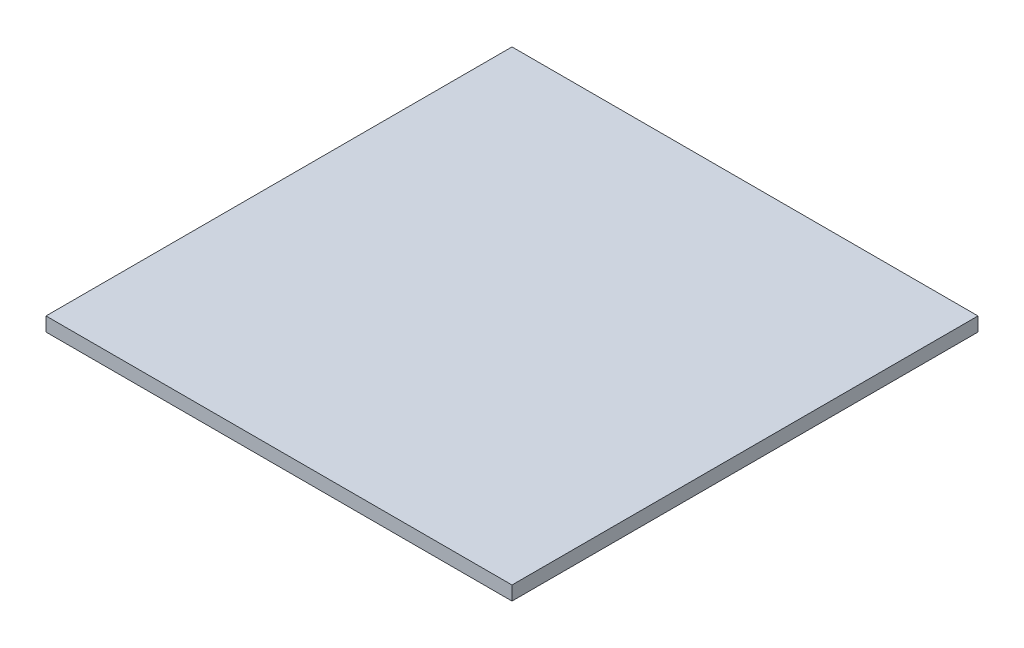
ISO-10303-21;
HEADER;
FILE_DESCRIPTION(('STEP AP214'),'2;1');
FILE_NAME('part.step','',(''),(''),'','','');
FILE_SCHEMA(('AUTOMOTIVE_DESIGN { 1 0 10303 214 1 1 1 1 }'));
ENDSEC;
DATA;
#1=APPLICATION_CONTEXT('core data for automotive mechanical design processes');
#2=APPLICATION_PROTOCOL_DEFINITION('international standard','automotive_design',2000,#1);
#3=PRODUCT_CONTEXT('',#1,'mechanical');
#4=PRODUCT('Part','Part','',(#3));
#5=PRODUCT_RELATED_PRODUCT_CATEGORY('part','',(#4));
#6=PRODUCT_DEFINITION_FORMATION('','',#4);
#7=PRODUCT_DEFINITION_CONTEXT('part definition',#1,'design');
#8=PRODUCT_DEFINITION('design','',#6,#7);
#9=PRODUCT_DEFINITION_SHAPE('','',#8);
#10=(LENGTH_UNIT() NAMED_UNIT(*) SI_UNIT(.MILLI.,.METRE.));
#11=(NAMED_UNIT(*) PLANE_ANGLE_UNIT() SI_UNIT($,.RADIAN.));
#12=(NAMED_UNIT(*) SI_UNIT($,.STERADIAN.) SOLID_ANGLE_UNIT());
#13=UNCERTAINTY_MEASURE_WITH_UNIT(LENGTH_MEASURE(1.E-05),#10,'distance_accuracy_value','');
#14=(GEOMETRIC_REPRESENTATION_CONTEXT(3) GLOBAL_UNCERTAINTY_ASSIGNED_CONTEXT((#13)) GLOBAL_UNIT_ASSIGNED_CONTEXT((#10,
#11,#12)) REPRESENTATION_CONTEXT('',''));
#15=CARTESIAN_POINT('',(0.,0.,0.));
#16=DIRECTION('',(0.,0.,1.));
#17=DIRECTION('',(1.,0.,0.));
#18=AXIS2_PLACEMENT_3D('',#15,#16,#17);
#19=CARTESIAN_POINT('',(0.,0.3,0.));
#20=DIRECTION('',(1.,0.,0.));
#21=DIRECTION('',(0.,0.,-1.));
#22=AXIS2_PLACEMENT_3D('',#19,#20,#21);
#23=PLANE('',#22);
#24=DIRECTION('',(0.,0.,1.));
#25=VECTOR('',#24,1.);
#26=CARTESIAN_POINT('',(0.,0.,0.));
#27=LINE('',#26,#25);
#28=CARTESIAN_POINT('',(0.,0.,0.));
#29=VERTEX_POINT('',#28);
#30=CARTESIAN_POINT('',(0.,0.,10.));
#31=VERTEX_POINT('',#30);
#32=EDGE_CURVE('E99',#29,#31,#27,.T.);
#33=ORIENTED_EDGE('',*,*,#32,.T.);
#34=DIRECTION('',(0.,-1.,0.));
#35=VECTOR('',#34,1.);
#36=CARTESIAN_POINT('',(0.,0.3,10.));
#37=LINE('',#36,#35);
#38=CARTESIAN_POINT('',(0.,0.3,10.));
#39=VERTEX_POINT('',#38);
#40=EDGE_CURVE('E11',#39,#31,#37,.T.);
#41=ORIENTED_EDGE('',*,*,#40,.F.);
#42=DIRECTION('',(0.,0.,1.));
#43=VECTOR('',#42,1.);
#44=CARTESIAN_POINT('',(0.,0.3,0.));
#45=LINE('',#44,#43);
#46=CARTESIAN_POINT('',(0.,0.3,0.));
#47=VERTEX_POINT('',#46);
#48=EDGE_CURVE('E87',#47,#39,#45,.T.);
#49=ORIENTED_EDGE('',*,*,#48,.F.);
#50=DIRECTION('',(0.,-1.,0.));
#51=VECTOR('',#50,1.);
#52=CARTESIAN_POINT('',(0.,0.3,0.));
#53=LINE('',#52,#51);
#54=EDGE_CURVE('E95',#47,#29,#53,.T.);
#55=ORIENTED_EDGE('',*,*,#54,.T.);
#56=EDGE_LOOP('',(#33,#41,#49,#55));
#57=FACE_BOUND('',#56,.T.);
#58=ADVANCED_FACE('F36',(#57),#23,.F.);
#59=CARTESIAN_POINT('',(0.,0.3,10.));
#60=DIRECTION('',(0.,0.,-1.));
#61=DIRECTION('',(-1.,0.,0.));
#62=AXIS2_PLACEMENT_3D('',#59,#60,#61);
#63=PLANE('',#62);
#64=DIRECTION('',(1.,0.,0.));
#65=VECTOR('',#64,1.);
#66=CARTESIAN_POINT('',(0.,0.,10.));
#67=LINE('',#66,#65);
#68=CARTESIAN_POINT('',(10.,0.,10.));
#69=VERTEX_POINT('',#68);
#70=EDGE_CURVE('E91',#31,#69,#67,.T.);
#71=ORIENTED_EDGE('',*,*,#70,.T.);
#72=DIRECTION('',(0.,-1.,0.));
#73=VECTOR('',#72,1.);
#74=CARTESIAN_POINT('',(10.,0.3,10.));
#75=LINE('',#74,#73);
#76=CARTESIAN_POINT('',(10.,0.3,10.));
#77=VERTEX_POINT('',#76);
#78=EDGE_CURVE('E44',#77,#69,#75,.T.);
#79=ORIENTED_EDGE('',*,*,#78,.F.);
#80=DIRECTION('',(1.,0.,0.));
#81=VECTOR('',#80,1.);
#82=CARTESIAN_POINT('',(0.,0.3,10.));
#83=LINE('',#82,#81);
#84=EDGE_CURVE('E82',#39,#77,#83,.T.);
#85=ORIENTED_EDGE('',*,*,#84,.F.);
#86=ORIENTED_EDGE('',*,*,#40,.T.);
#87=EDGE_LOOP('',(#71,#79,#85,#86));
#88=FACE_BOUND('',#87,.T.);
#89=ADVANCED_FACE('F90',(#88),#63,.F.);
#90=CARTESIAN_POINT('',(10.,0.3,0.));
#91=DIRECTION('',(-1.,0.,0.));
#92=DIRECTION('',(0.,0.,1.));
#93=AXIS2_PLACEMENT_3D('',#90,#91,#92);
#94=PLANE('',#93);
#95=DIRECTION('',(0.,0.,-1.));
#96=VECTOR('',#95,1.);
#97=CARTESIAN_POINT('',(10.,0.,0.));
#98=LINE('',#97,#96);
#99=CARTESIAN_POINT('',(10.,0.,0.));
#100=VERTEX_POINT('',#99);
#101=EDGE_CURVE('E69',#69,#100,#98,.T.);
#102=ORIENTED_EDGE('',*,*,#101,.T.);
#103=DIRECTION('',(0.,-1.,0.));
#104=VECTOR('',#103,1.);
#105=CARTESIAN_POINT('',(10.,0.3,0.));
#106=LINE('',#105,#104);
#107=CARTESIAN_POINT('',(10.,0.3,0.));
#108=VERTEX_POINT('',#107);
#109=EDGE_CURVE('E92',#108,#100,#106,.T.);
#110=ORIENTED_EDGE('',*,*,#109,.F.);
#111=DIRECTION('',(0.,0.,-1.));
#112=VECTOR('',#111,1.);
#113=CARTESIAN_POINT('',(10.,0.3,0.));
#114=LINE('',#113,#112);
#115=EDGE_CURVE('E85',#77,#108,#114,.T.);
#116=ORIENTED_EDGE('',*,*,#115,.F.);
#117=ORIENTED_EDGE('',*,*,#78,.T.);
#118=EDGE_LOOP('',(#102,#110,#116,#117));
#119=FACE_BOUND('',#118,.T.);
#120=ADVANCED_FACE('F93',(#119),#94,.F.);
#121=CARTESIAN_POINT('',(0.,0.3,0.));
#122=DIRECTION('',(0.,0.,1.));
#123=DIRECTION('',(1.,0.,0.));
#124=AXIS2_PLACEMENT_3D('',#121,#122,#123);
#125=PLANE('',#124);
#126=DIRECTION('',(-1.,0.,0.));
#127=VECTOR('',#126,1.);
#128=CARTESIAN_POINT('',(0.,0.,0.));
#129=LINE('',#128,#127);
#130=EDGE_CURVE('E75',#100,#29,#129,.T.);
#131=ORIENTED_EDGE('',*,*,#130,.T.);
#132=ORIENTED_EDGE('',*,*,#54,.F.);
#133=DIRECTION('',(-1.,0.,0.));
#134=VECTOR('',#133,1.);
#135=CARTESIAN_POINT('',(0.,0.3,0.));
#136=LINE('',#135,#134);
#137=EDGE_CURVE('E52',#108,#47,#136,.T.);
#138=ORIENTED_EDGE('',*,*,#137,.F.);
#139=ORIENTED_EDGE('',*,*,#109,.T.);
#140=EDGE_LOOP('',(#131,#132,#138,#139));
#141=FACE_BOUND('',#140,.T.);
#142=ADVANCED_FACE('F106',(#141),#125,.F.);
#143=CARTESIAN_POINT('',(0.,0.3,0.));
#144=DIRECTION('',(0.,1.,0.));
#145=DIRECTION('',(0.,0.,1.));
#146=AXIS2_PLACEMENT_3D('',#143,#144,#145);
#147=PLANE('',#146);
#148=ORIENTED_EDGE('',*,*,#48,.T.);
#149=ORIENTED_EDGE('',*,*,#84,.T.);
#150=ORIENTED_EDGE('',*,*,#115,.T.);
#151=ORIENTED_EDGE('',*,*,#137,.T.);
#152=EDGE_LOOP('',(#148,#149,#150,#151));
#153=FACE_BOUND('',#152,.T.);
#154=ADVANCED_FACE('F83',(#153),#147,.T.);
#155=CARTESIAN_POINT('',(0.,0.,0.));
#156=DIRECTION('',(0.,1.,0.));
#157=DIRECTION('',(0.,0.,1.));
#158=AXIS2_PLACEMENT_3D('',#155,#156,#157);
#159=PLANE('',#158);
#160=ORIENTED_EDGE('',*,*,#32,.F.);
#161=ORIENTED_EDGE('',*,*,#130,.F.);
#162=ORIENTED_EDGE('',*,*,#101,.F.);
#163=ORIENTED_EDGE('',*,*,#70,.F.);
#164=EDGE_LOOP('',(#160,#161,#162,#163));
#165=FACE_BOUND('',#164,.T.);
#166=ADVANCED_FACE('F109',(#165),#159,.F.);
#167=CLOSED_SHELL('',(#58,#89,#120,#142,#154,#166));
#168=MANIFOLD_SOLID_BREP('B2',#167);
#169=ADVANCED_BREP_SHAPE_REPRESENTATION('',(#18,#168),#14);
#170=SHAPE_DEFINITION_REPRESENTATION(#9,#169);
ENDSEC;
END-ISO-10303-21;
